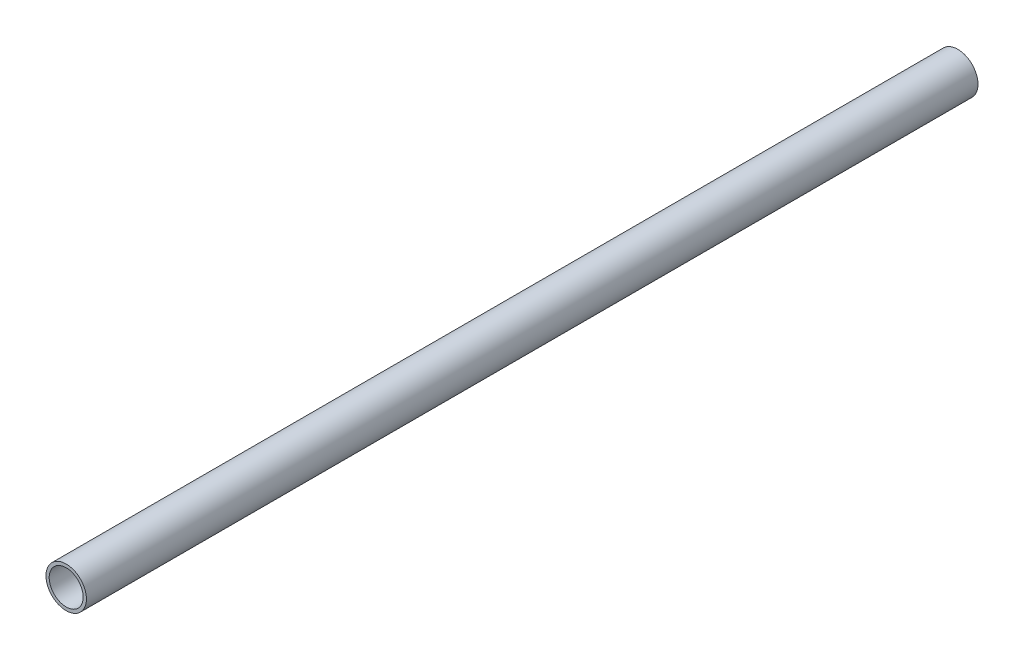
ISO-10303-21;
HEADER;
FILE_DESCRIPTION(('STEP AP214'),'2;1');
FILE_NAME('part.step','',(''),(''),'','','');
FILE_SCHEMA(('AUTOMOTIVE_DESIGN { 1 0 10303 214 1 1 1 1 }'));
ENDSEC;
DATA;
#1=APPLICATION_CONTEXT('core data for automotive mechanical design processes');
#2=APPLICATION_PROTOCOL_DEFINITION('international standard','automotive_design',2000,#1);
#3=PRODUCT_CONTEXT('',#1,'mechanical');
#4=PRODUCT('Part','Part','',(#3));
#5=PRODUCT_RELATED_PRODUCT_CATEGORY('part','',(#4));
#6=PRODUCT_DEFINITION_FORMATION('','',#4);
#7=PRODUCT_DEFINITION_CONTEXT('part definition',#1,'design');
#8=PRODUCT_DEFINITION('design','',#6,#7);
#9=PRODUCT_DEFINITION_SHAPE('','',#8);
#10=(LENGTH_UNIT() NAMED_UNIT(*) SI_UNIT(.MILLI.,.METRE.));
#11=(NAMED_UNIT(*) PLANE_ANGLE_UNIT() SI_UNIT($,.RADIAN.));
#12=(NAMED_UNIT(*) SI_UNIT($,.STERADIAN.) SOLID_ANGLE_UNIT());
#13=UNCERTAINTY_MEASURE_WITH_UNIT(LENGTH_MEASURE(1.E-05),#10,'distance_accuracy_value','');
#14=(GEOMETRIC_REPRESENTATION_CONTEXT(3) GLOBAL_UNCERTAINTY_ASSIGNED_CONTEXT((#13)) GLOBAL_UNIT_ASSIGNED_CONTEXT((#10,
#11,#12)) REPRESENTATION_CONTEXT('',''));
#15=CARTESIAN_POINT('',(0.,0.,0.));
#16=DIRECTION('',(0.,0.,1.));
#17=DIRECTION('',(1.,0.,0.));
#18=AXIS2_PLACEMENT_3D('',#15,#16,#17);
#19=CARTESIAN_POINT('',(0.,0.,140.));
#20=DIRECTION('',(0.,0.,1.));
#21=DIRECTION('',(1.,0.,0.));
#22=AXIS2_PLACEMENT_3D('',#19,#20,#21);
#23=PLANE('',#22);
#24=CARTESIAN_POINT('',(0.,0.,140.));
#25=DIRECTION('',(0.,0.,1.));
#26=DIRECTION('',(1.,0.,0.));
#27=AXIS2_PLACEMENT_3D('',#24,#25,#26);
#28=CIRCLE('',#27,3.175);
#29=CARTESIAN_POINT('',(3.175,0.,140.));
#30=VERTEX_POINT('',#29);
#31=EDGE_CURVE('E10',#30,#30,#28,.T.);
#32=ORIENTED_EDGE('',*,*,#31,.T.);
#33=EDGE_LOOP('',(#32));
#34=FACE_BOUND('',#33,.T.);
#35=CARTESIAN_POINT('',(0.,0.,140.));
#36=DIRECTION('',(0.,0.,1.));
#37=DIRECTION('',(1.,0.,0.));
#38=AXIS2_PLACEMENT_3D('',#35,#36,#37);
#39=CIRCLE('',#38,2.667);
#40=CARTESIAN_POINT('',(2.667,0.,140.));
#41=VERTEX_POINT('',#40);
#42=EDGE_CURVE('E42',#41,#41,#39,.T.);
#43=ORIENTED_EDGE('',*,*,#42,.F.);
#44=EDGE_LOOP('',(#43));
#45=FACE_BOUND('',#44,.T.);
#46=ADVANCED_FACE('F31',(#34,#45),#23,.T.);
#47=CARTESIAN_POINT('',(0.,0.,0.));
#48=DIRECTION('',(0.,0.,1.));
#49=DIRECTION('',(1.,0.,0.));
#50=AXIS2_PLACEMENT_3D('',#47,#48,#49);
#51=PLANE('',#50);
#52=CARTESIAN_POINT('',(0.,0.,0.));
#53=DIRECTION('',(0.,0.,1.));
#54=DIRECTION('',(1.,0.,0.));
#55=AXIS2_PLACEMENT_3D('',#52,#53,#54);
#56=CIRCLE('',#55,3.175);
#57=CARTESIAN_POINT('',(3.175,0.,0.));
#58=VERTEX_POINT('',#57);
#59=EDGE_CURVE('E35',#58,#58,#56,.T.);
#60=ORIENTED_EDGE('',*,*,#59,.F.);
#61=EDGE_LOOP('',(#60));
#62=FACE_BOUND('',#61,.T.);
#63=CARTESIAN_POINT('',(0.,0.,0.));
#64=DIRECTION('',(0.,0.,1.));
#65=DIRECTION('',(1.,0.,0.));
#66=AXIS2_PLACEMENT_3D('',#63,#64,#65);
#67=CIRCLE('',#66,2.667);
#68=CARTESIAN_POINT('',(2.667,0.,0.));
#69=VERTEX_POINT('',#68);
#70=EDGE_CURVE('E44',#69,#69,#67,.T.);
#71=ORIENTED_EDGE('',*,*,#70,.T.);
#72=EDGE_LOOP('',(#71));
#73=FACE_BOUND('',#72,.T.);
#74=ADVANCED_FACE('F54',(#62,#73),#51,.F.);
#75=CARTESIAN_POINT('',(0.,0.,140.));
#76=DIRECTION('',(0.,0.,-1.));
#77=DIRECTION('',(-1.,0.,0.));
#78=AXIS2_PLACEMENT_3D('',#75,#76,#77);
#79=CYLINDRICAL_SURFACE('',#78,3.175);
#80=ORIENTED_EDGE('',*,*,#31,.F.);
#81=EDGE_LOOP('',(#80));
#82=FACE_BOUND('',#81,.T.);
#83=ORIENTED_EDGE('',*,*,#59,.T.);
#84=EDGE_LOOP('',(#83));
#85=FACE_BOUND('',#84,.T.);
#86=ADVANCED_FACE('F33',(#82,#85),#79,.T.);
#87=CARTESIAN_POINT('',(0.,0.,140.));
#88=DIRECTION('',(0.,0.,-1.));
#89=DIRECTION('',(-1.,0.,0.));
#90=AXIS2_PLACEMENT_3D('',#87,#88,#89);
#91=CYLINDRICAL_SURFACE('',#90,2.667);
#92=ORIENTED_EDGE('',*,*,#42,.T.);
#93=EDGE_LOOP('',(#92));
#94=FACE_BOUND('',#93,.T.);
#95=ORIENTED_EDGE('',*,*,#70,.F.);
#96=EDGE_LOOP('',(#95));
#97=FACE_BOUND('',#96,.T.);
#98=ADVANCED_FACE('F50',(#94,#97),#91,.F.);
#99=CLOSED_SHELL('',(#46,#74,#86,#98));
#100=MANIFOLD_SOLID_BREP('B2',#99);
#101=ADVANCED_BREP_SHAPE_REPRESENTATION('',(#18,#100),#14);
#102=SHAPE_DEFINITION_REPRESENTATION(#9,#101);
ENDSEC;
END-ISO-10303-21;
